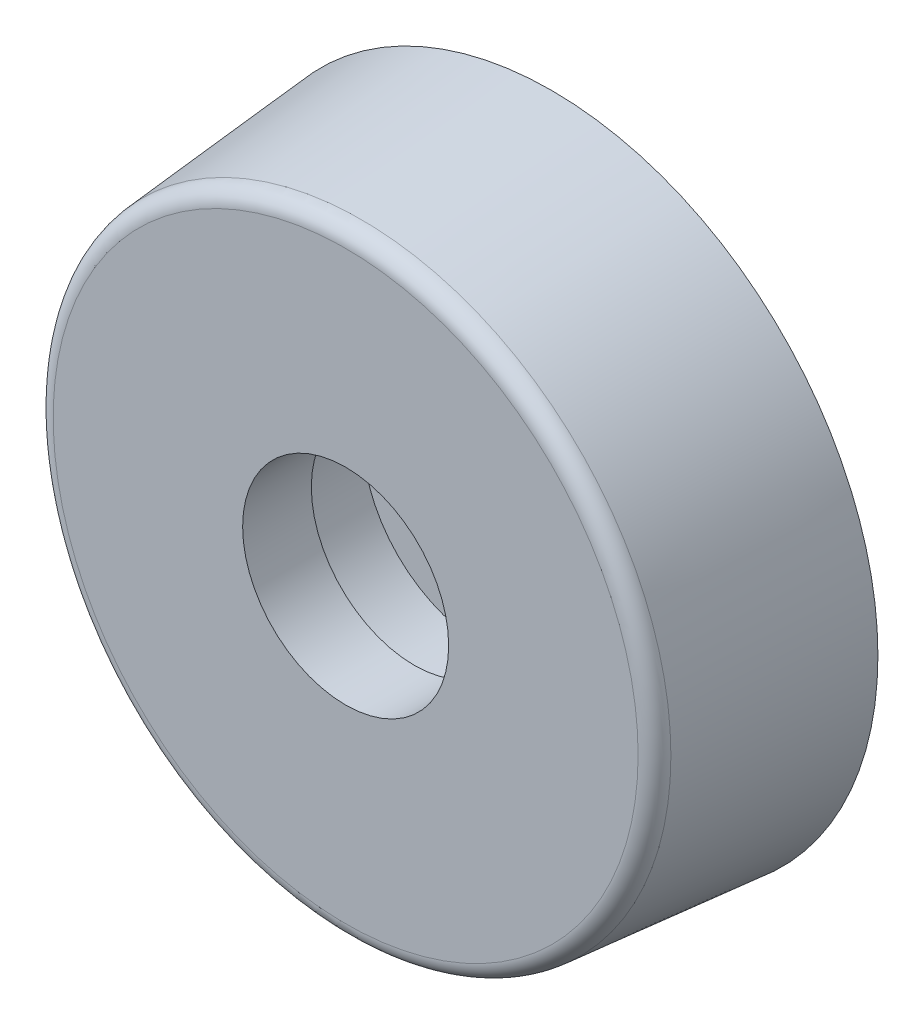
ISO-10303-21;
HEADER;
FILE_DESCRIPTION(('STEP AP214'),'2;1');
FILE_NAME('part.step','',(''),(''),'','','');
FILE_SCHEMA(('AUTOMOTIVE_DESIGN { 1 0 10303 214 1 1 1 1 }'));
ENDSEC;
DATA;
#1=APPLICATION_CONTEXT('core data for automotive mechanical design processes');
#2=APPLICATION_PROTOCOL_DEFINITION('international standard','automotive_design',2000,#1);
#3=PRODUCT_CONTEXT('',#1,'mechanical');
#4=PRODUCT('Part','Part','',(#3));
#5=PRODUCT_RELATED_PRODUCT_CATEGORY('part','',(#4));
#6=PRODUCT_DEFINITION_FORMATION('','',#4);
#7=PRODUCT_DEFINITION_CONTEXT('part definition',#1,'design');
#8=PRODUCT_DEFINITION('design','',#6,#7);
#9=PRODUCT_DEFINITION_SHAPE('','',#8);
#10=(LENGTH_UNIT() NAMED_UNIT(*) SI_UNIT(.MILLI.,.METRE.));
#11=(NAMED_UNIT(*) PLANE_ANGLE_UNIT() SI_UNIT($,.RADIAN.));
#12=(NAMED_UNIT(*) SI_UNIT($,.STERADIAN.) SOLID_ANGLE_UNIT());
#13=UNCERTAINTY_MEASURE_WITH_UNIT(LENGTH_MEASURE(1.E-05),#10,'distance_accuracy_value','');
#14=(GEOMETRIC_REPRESENTATION_CONTEXT(3) GLOBAL_UNCERTAINTY_ASSIGNED_CONTEXT((#13)) GLOBAL_UNIT_ASSIGNED_CONTEXT((#10,
#11,#12)) REPRESENTATION_CONTEXT('',''));
#15=CARTESIAN_POINT('',(0.,0.,0.));
#16=DIRECTION('',(0.,0.,1.));
#17=DIRECTION('',(1.,0.,0.));
#18=AXIS2_PLACEMENT_3D('',#15,#16,#17);
#19=CARTESIAN_POINT('',(0.,0.,0.));
#20=DIRECTION('',(0.,0.,-1.));
#21=DIRECTION('',(1.,0.,0.));
#22=AXIS2_PLACEMENT_3D('',#19,#20,#21);
#23=CONICAL_SURFACE('',#22,9.5,0.0872664625997165);
#24=CARTESIAN_POINT('',(0.,0.,5.54357787137383));
#25=DIRECTION('',(0.,0.,-1.));
#26=DIRECTION('',(-1.,0.,0.));
#27=AXIS2_PLACEMENT_3D('',#24,#25,#26);
#28=CIRCLE('',#27,9.01499978088162);
#29=CARTESIAN_POINT('',(-9.01499978088162,0.,5.54357787137383));
#30=VERTEX_POINT('',#29);
#31=EDGE_CURVE('E10',#30,#30,#28,.T.);
#32=ORIENTED_EDGE('',*,*,#31,.T.);
#33=EDGE_LOOP('',(#32));
#34=FACE_BOUND('',#33,.T.);
#35=CARTESIAN_POINT('',(0.,0.,0.));
#36=DIRECTION('',(0.,0.,1.));
#37=DIRECTION('',(1.,0.,0.));
#38=AXIS2_PLACEMENT_3D('',#35,#36,#37);
#39=CIRCLE('',#38,9.5);
#40=CARTESIAN_POINT('',(9.5,0.,0.));
#41=VERTEX_POINT('',#40);
#42=EDGE_CURVE('E48',#41,#41,#39,.T.);
#43=ORIENTED_EDGE('',*,*,#42,.T.);
#44=EDGE_LOOP('',(#43));
#45=FACE_BOUND('',#44,.T.);
#46=ADVANCED_FACE('F33',(#34,#45),#23,.T.);
#47=CARTESIAN_POINT('',(0.,0.,6.));
#48=DIRECTION('',(0.,0.,1.));
#49=DIRECTION('',(1.,0.,0.));
#50=AXIS2_PLACEMENT_3D('',#47,#48,#49);
#51=PLANE('',#50);
#52=CARTESIAN_POINT('',(0.,0.,6.));
#53=DIRECTION('',(0.,0.,1.));
#54=DIRECTION('',(1.,0.,0.));
#55=AXIS2_PLACEMENT_3D('',#52,#53,#54);
#56=CIRCLE('',#55,8.51690243183574);
#57=CARTESIAN_POINT('',(8.51690243183574,0.,6.));
#58=VERTEX_POINT('',#57);
#59=EDGE_CURVE('E40',#58,#58,#56,.T.);
#60=ORIENTED_EDGE('',*,*,#59,.T.);
#61=EDGE_LOOP('',(#60));
#62=FACE_BOUND('',#61,.T.);
#63=CARTESIAN_POINT('',(0.,0.,6.));
#64=DIRECTION('',(0.,0.,1.));
#65=DIRECTION('',(1.,0.,0.));
#66=AXIS2_PLACEMENT_3D('',#63,#64,#65);
#67=CIRCLE('',#66,3.);
#68=CARTESIAN_POINT('',(3.,0.,6.));
#69=VERTEX_POINT('',#68);
#70=EDGE_CURVE('E69',#69,#69,#67,.T.);
#71=ORIENTED_EDGE('',*,*,#70,.F.);
#72=EDGE_LOOP('',(#71));
#73=FACE_BOUND('',#72,.T.);
#74=ADVANCED_FACE('F85',(#62,#73),#51,.T.);
#75=CARTESIAN_POINT('',(0.,0.,0.));
#76=DIRECTION('',(0.,0.,1.));
#77=DIRECTION('',(1.,0.,0.));
#78=AXIS2_PLACEMENT_3D('',#75,#76,#77);
#79=PLANE('',#78);
#80=CARTESIAN_POINT('',(0.,0.,0.));
#81=DIRECTION('',(0.,0.,-1.));
#82=DIRECTION('',(-1.,0.,0.));
#83=AXIS2_PLACEMENT_3D('',#80,#81,#82);
#84=CIRCLE('',#83,8.);
#85=CARTESIAN_POINT('',(-8.,0.,0.));
#86=VERTEX_POINT('',#85);
#87=EDGE_CURVE('E54',#86,#86,#84,.T.);
#88=ORIENTED_EDGE('',*,*,#87,.F.);
#89=EDGE_LOOP('',(#88));
#90=FACE_BOUND('',#89,.T.);
#91=ORIENTED_EDGE('',*,*,#42,.F.);
#92=EDGE_LOOP('',(#91));
#93=FACE_BOUND('',#92,.T.);
#94=ADVANCED_FACE('F87',(#90,#93),#79,.F.);
#95=CARTESIAN_POINT('',(0.,0.,3.));
#96=DIRECTION('',(0.,0.,-1.));
#97=DIRECTION('',(-1.,0.,0.));
#98=AXIS2_PLACEMENT_3D('',#95,#96,#97);
#99=CYLINDRICAL_SURFACE('',#98,8.);
#100=CARTESIAN_POINT('',(0.,0.,3.));
#101=DIRECTION('',(0.,0.,-1.));
#102=DIRECTION('',(-1.,0.,0.));
#103=AXIS2_PLACEMENT_3D('',#100,#101,#102);
#104=CIRCLE('',#103,8.);
#105=CARTESIAN_POINT('',(-8.,0.,3.));
#106=VERTEX_POINT('',#105);
#107=EDGE_CURVE('E53',#106,#106,#104,.T.);
#108=ORIENTED_EDGE('',*,*,#107,.F.);
#109=EDGE_LOOP('',(#108));
#110=FACE_BOUND('',#109,.T.);
#111=ORIENTED_EDGE('',*,*,#87,.T.);
#112=EDGE_LOOP('',(#111));
#113=FACE_BOUND('',#112,.T.);
#114=ADVANCED_FACE('F93',(#110,#113),#99,.F.);
#115=CARTESIAN_POINT('',(0.,0.,3.));
#116=DIRECTION('',(0.,0.,-1.));
#117=DIRECTION('',(-1.,0.,0.));
#118=AXIS2_PLACEMENT_3D('',#115,#116,#117);
#119=PLANE('',#118);
#120=CARTESIAN_POINT('',(0.,0.,3.));
#121=DIRECTION('',(0.,0.,-1.));
#122=DIRECTION('',(-1.,0.,0.));
#123=AXIS2_PLACEMENT_3D('',#120,#121,#122);
#124=CIRCLE('',#123,4.5);
#125=CARTESIAN_POINT('',(-4.5,0.,3.));
#126=VERTEX_POINT('',#125);
#127=EDGE_CURVE('E57',#126,#126,#124,.T.);
#128=ORIENTED_EDGE('',*,*,#127,.F.);
#129=EDGE_LOOP('',(#128));
#130=FACE_BOUND('',#129,.T.);
#131=ORIENTED_EDGE('',*,*,#107,.T.);
#132=EDGE_LOOP('',(#131));
#133=FACE_BOUND('',#132,.T.);
#134=ADVANCED_FACE('F100',(#130,#133),#119,.T.);
#135=CARTESIAN_POINT('',(0.,0.,3.));
#136=DIRECTION('',(0.,0.,-1.));
#137=DIRECTION('',(-1.,0.,0.));
#138=AXIS2_PLACEMENT_3D('',#135,#136,#137);
#139=CYLINDRICAL_SURFACE('',#138,4.5);
#140=ORIENTED_EDGE('',*,*,#127,.T.);
#141=EDGE_LOOP('',(#140));
#142=FACE_BOUND('',#141,.T.);
#143=CARTESIAN_POINT('',(0.,0.,0.));
#144=DIRECTION('',(0.,0.,-1.));
#145=DIRECTION('',(-1.,0.,0.));
#146=AXIS2_PLACEMENT_3D('',#143,#144,#145);
#147=CIRCLE('',#146,4.5);
#148=CARTESIAN_POINT('',(-4.5,0.,0.));
#149=VERTEX_POINT('',#148);
#150=EDGE_CURVE('E60',#149,#149,#147,.T.);
#151=ORIENTED_EDGE('',*,*,#150,.F.);
#152=EDGE_LOOP('',(#151));
#153=FACE_BOUND('',#152,.T.);
#154=ADVANCED_FACE('F104',(#142,#153),#139,.T.);
#155=ORIENTED_EDGE('',*,*,#150,.T.);
#156=EDGE_LOOP('',(#155));
#157=FACE_BOUND('',#156,.T.);
#158=ADVANCED_FACE('F96',(#157),#79,.F.);
#159=CARTESIAN_POINT('',(0.,0.,4.));
#160=DIRECTION('',(0.,0.,1.));
#161=DIRECTION('',(1.,0.,0.));
#162=AXIS2_PLACEMENT_3D('',#159,#160,#161);
#163=PLANE('',#162);
#164=CARTESIAN_POINT('',(0.,0.,4.));
#165=DIRECTION('',(0.,0.,1.));
#166=DIRECTION('',(1.,0.,0.));
#167=AXIS2_PLACEMENT_3D('',#164,#165,#166);
#168=CIRCLE('',#167,3.);
#169=CARTESIAN_POINT('',(3.,0.,4.));
#170=VERTEX_POINT('',#169);
#171=EDGE_CURVE('E68',#170,#170,#168,.T.);
#172=ORIENTED_EDGE('',*,*,#171,.T.);
#173=EDGE_LOOP('',(#172));
#174=FACE_BOUND('',#173,.T.);
#175=CARTESIAN_POINT('',(0.,0.,4.));
#176=DIRECTION('',(0.,0.,1.));
#177=DIRECTION('',(1.,0.,0.));
#178=AXIS2_PLACEMENT_3D('',#175,#176,#177);
#179=CIRCLE('',#178,3.5);
#180=CARTESIAN_POINT('',(3.5,0.,4.));
#181=VERTEX_POINT('',#180);
#182=EDGE_CURVE('E44',#181,#181,#179,.F.);
#183=ORIENTED_EDGE('',*,*,#182,.T.);
#184=EDGE_LOOP('',(#183));
#185=FACE_BOUND('',#184,.T.);
#186=ADVANCED_FACE('F75',(#174,#185),#163,.F.);
#187=CARTESIAN_POINT('',(0.,0.,4.));
#188=DIRECTION('',(0.,0.,1.));
#189=DIRECTION('',(1.,0.,0.));
#190=AXIS2_PLACEMENT_3D('',#187,#188,#189);
#191=CYLINDRICAL_SURFACE('',#190,3.);
#192=ORIENTED_EDGE('',*,*,#171,.F.);
#193=EDGE_LOOP('',(#192));
#194=FACE_BOUND('',#193,.T.);
#195=ORIENTED_EDGE('',*,*,#70,.T.);
#196=EDGE_LOOP('',(#195));
#197=FACE_BOUND('',#196,.T.);
#198=ADVANCED_FACE('F78',(#194,#197),#191,.F.);
#199=CARTESIAN_POINT('',(0.,0.,2.));
#200=DIRECTION('',(0.,0.,1.));
#201=DIRECTION('',(1.,0.,0.));
#202=AXIS2_PLACEMENT_3D('',#199,#200,#201);
#203=PLANE('',#202);
#204=CARTESIAN_POINT('',(0.,0.,2.));
#205=DIRECTION('',(0.,0.,1.));
#206=DIRECTION('',(1.,0.,0.));
#207=AXIS2_PLACEMENT_3D('',#204,#205,#206);
#208=CIRCLE('',#207,3.5);
#209=CARTESIAN_POINT('',(3.5,0.,2.));
#210=VERTEX_POINT('',#209);
#211=EDGE_CURVE('E63',#210,#210,#208,.T.);
#212=ORIENTED_EDGE('',*,*,#211,.T.);
#213=EDGE_LOOP('',(#212));
#214=FACE_BOUND('',#213,.T.);
#215=ADVANCED_FACE('F81',(#214),#203,.T.);
#216=CARTESIAN_POINT('',(0.,0.,2.));
#217=DIRECTION('',(0.,0.,1.));
#218=DIRECTION('',(1.,0.,0.));
#219=AXIS2_PLACEMENT_3D('',#216,#217,#218);
#220=CYLINDRICAL_SURFACE('',#219,3.5);
#221=ORIENTED_EDGE('',*,*,#211,.F.);
#222=EDGE_LOOP('',(#221));
#223=FACE_BOUND('',#222,.T.);
#224=ORIENTED_EDGE('',*,*,#182,.F.);
#225=EDGE_LOOP('',(#224));
#226=FACE_BOUND('',#225,.T.);
#227=ADVANCED_FACE('F109',(#223,#226),#220,.F.);
#228=CARTESIAN_POINT('',(0.,0.,5.5));
#229=DIRECTION('',(0.,0.,1.));
#230=DIRECTION('',(1.,0.,0.));
#231=AXIS2_PLACEMENT_3D('',#228,#229,#230);
#232=TOROIDAL_SURFACE('',#231,8.51690243183574,0.5);
#233=ORIENTED_EDGE('',*,*,#31,.F.);
#234=EDGE_LOOP('',(#233));
#235=FACE_BOUND('',#234,.T.);
#236=ORIENTED_EDGE('',*,*,#59,.F.);
#237=EDGE_LOOP('',(#236));
#238=FACE_BOUND('',#237,.T.);
#239=ADVANCED_FACE('F35',(#235,#238),#232,.T.);
#240=CLOSED_SHELL('',(#46,#74,#94,#114,#134,#154,#158,#186,#198,#215,#227,#239));
#241=MANIFOLD_SOLID_BREP('B2',#240);
#242=ADVANCED_BREP_SHAPE_REPRESENTATION('',(#18,#241),#14);
#243=SHAPE_DEFINITION_REPRESENTATION(#9,#242);
ENDSEC;
END-ISO-10303-21;
